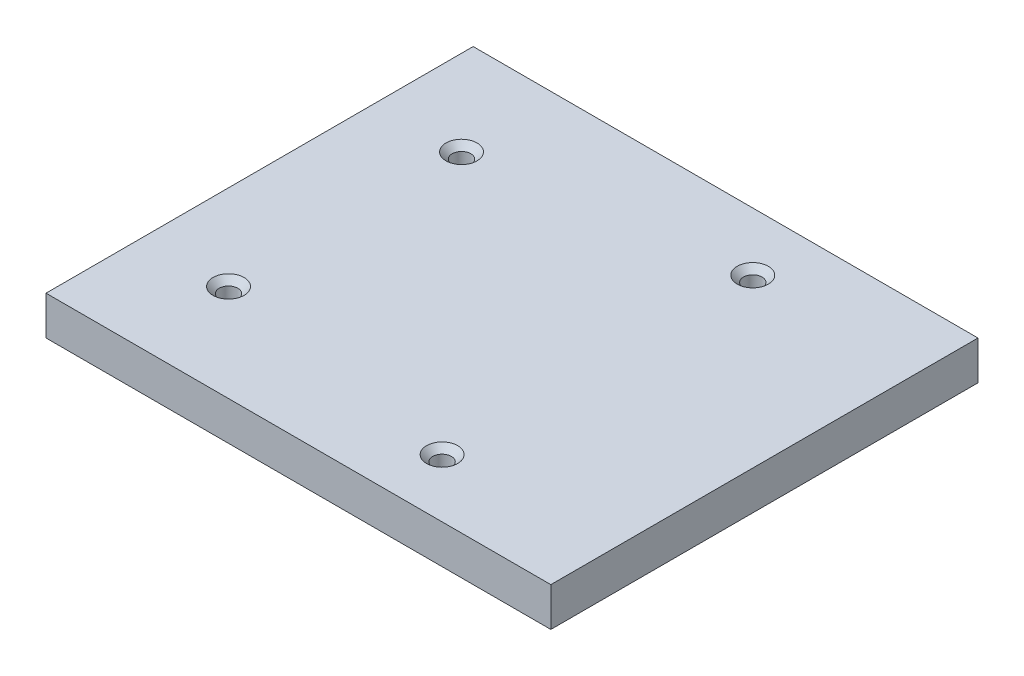
ISO-10303-21;
HEADER;
FILE_DESCRIPTION(('STEP AP214'),'2;1');
FILE_NAME('part.step','',(''),(''),'','','');
FILE_SCHEMA(('AUTOMOTIVE_DESIGN { 1 0 10303 214 1 1 1 1 }'));
ENDSEC;
DATA;
#1=APPLICATION_CONTEXT('core data for automotive mechanical design processes');
#2=APPLICATION_PROTOCOL_DEFINITION('international standard','automotive_design',2000,#1);
#3=PRODUCT_CONTEXT('',#1,'mechanical');
#4=PRODUCT('Part','Part','',(#3));
#5=PRODUCT_RELATED_PRODUCT_CATEGORY('part','',(#4));
#6=PRODUCT_DEFINITION_FORMATION('','',#4);
#7=PRODUCT_DEFINITION_CONTEXT('part definition',#1,'design');
#8=PRODUCT_DEFINITION('design','',#6,#7);
#9=PRODUCT_DEFINITION_SHAPE('','',#8);
#10=(LENGTH_UNIT() NAMED_UNIT(*) SI_UNIT(.MILLI.,.METRE.));
#11=(NAMED_UNIT(*) PLANE_ANGLE_UNIT() SI_UNIT($,.RADIAN.));
#12=(NAMED_UNIT(*) SI_UNIT($,.STERADIAN.) SOLID_ANGLE_UNIT());
#13=UNCERTAINTY_MEASURE_WITH_UNIT(LENGTH_MEASURE(1.E-05),#10,'distance_accuracy_value','');
#14=(GEOMETRIC_REPRESENTATION_CONTEXT(3) GLOBAL_UNCERTAINTY_ASSIGNED_CONTEXT((#13)) GLOBAL_UNIT_ASSIGNED_CONTEXT((#10,
#11,#12)) REPRESENTATION_CONTEXT('',''));
#15=CARTESIAN_POINT('',(0.,0.,0.));
#16=DIRECTION('',(0.,0.,1.));
#17=DIRECTION('',(1.,0.,0.));
#18=AXIS2_PLACEMENT_3D('',#15,#16,#17);
#19=CARTESIAN_POINT('',(0.,5.,0.));
#20=DIRECTION('',(0.,-1.,0.));
#21=DIRECTION('',(0.,0.,-1.));
#22=AXIS2_PLACEMENT_3D('',#19,#20,#21);
#23=PLANE('',#22);
#24=CARTESIAN_POINT('',(22.,5.,40.));
#25=DIRECTION('',(0.,-1.,0.));
#26=DIRECTION('',(0.,0.,-1.));
#27=AXIS2_PLACEMENT_3D('',#24,#25,#26);
#28=CIRCLE('',#27,3.99999999999999);
#29=CARTESIAN_POINT('',(22.,5.,44.));
#30=VERTEX_POINT('',#29);
#31=EDGE_CURVE('E128',#30,#30,#28,.T.);
#32=ORIENTED_EDGE('',*,*,#31,.T.);
#33=EDGE_LOOP('',(#32));
#34=FACE_BOUND('',#33,.T.);
#35=CARTESIAN_POINT('',(-43.,5.,30.));
#36=DIRECTION('',(0.,-1.,0.));
#37=DIRECTION('',(0.,0.,-1.));
#38=AXIS2_PLACEMENT_3D('',#35,#36,#37);
#39=CIRCLE('',#38,3.99999999999999);
#40=CARTESIAN_POINT('',(-43.,5.,34.));
#41=VERTEX_POINT('',#40);
#42=EDGE_CURVE('E125',#41,#41,#39,.T.);
#43=ORIENTED_EDGE('',*,*,#42,.T.);
#44=EDGE_LOOP('',(#43));
#45=FACE_BOUND('',#44,.T.);
#46=CARTESIAN_POINT('',(22.,5.,-40.));
#47=DIRECTION('',(0.,-1.,0.));
#48=DIRECTION('',(0.,0.,-1.));
#49=AXIS2_PLACEMENT_3D('',#46,#47,#48);
#50=CIRCLE('',#49,3.99999999999999);
#51=CARTESIAN_POINT('',(22.,5.,-36.));
#52=VERTEX_POINT('',#51);
#53=EDGE_CURVE('E122',#52,#52,#50,.T.);
#54=ORIENTED_EDGE('',*,*,#53,.T.);
#55=EDGE_LOOP('',(#54));
#56=FACE_BOUND('',#55,.T.);
#57=CARTESIAN_POINT('',(-43.,5.,-30.));
#58=DIRECTION('',(0.,-1.,0.));
#59=DIRECTION('',(0.,0.,-1.));
#60=AXIS2_PLACEMENT_3D('',#57,#58,#59);
#61=CIRCLE('',#60,3.99999999999999);
#62=CARTESIAN_POINT('',(-43.,5.,-26.));
#63=VERTEX_POINT('',#62);
#64=EDGE_CURVE('E119',#63,#63,#61,.T.);
#65=ORIENTED_EDGE('',*,*,#64,.T.);
#66=EDGE_LOOP('',(#65));
#67=FACE_BOUND('',#66,.T.);
#68=DIRECTION('',(0.,0.,-1.));
#69=VECTOR('',#68,1.);
#70=CARTESIAN_POINT('',(65.,5.,55.));
#71=LINE('',#70,#69);
#72=CARTESIAN_POINT('',(65.,5.,55.));
#73=VERTEX_POINT('',#72);
#74=CARTESIAN_POINT('',(65.,5.,-55.));
#75=VERTEX_POINT('',#74);
#76=EDGE_CURVE('E91',#73,#75,#71,.T.);
#77=ORIENTED_EDGE('',*,*,#76,.T.);
#78=DIRECTION('',(-1.,0.,0.));
#79=VECTOR('',#78,1.);
#80=CARTESIAN_POINT('',(-65.,5.,-55.));
#81=LINE('',#80,#79);
#82=CARTESIAN_POINT('',(-65.,5.,-55.));
#83=VERTEX_POINT('',#82);
#84=EDGE_CURVE('E87',#75,#83,#81,.T.);
#85=ORIENTED_EDGE('',*,*,#84,.T.);
#86=DIRECTION('',(0.,0.,1.));
#87=VECTOR('',#86,1.);
#88=CARTESIAN_POINT('',(-65.,5.,55.));
#89=LINE('',#88,#87);
#90=CARTESIAN_POINT('',(-65.,5.,55.));
#91=VERTEX_POINT('',#90);
#92=EDGE_CURVE('E89',#83,#91,#89,.T.);
#93=ORIENTED_EDGE('',*,*,#92,.T.);
#94=DIRECTION('',(1.,0.,0.));
#95=VECTOR('',#94,1.);
#96=CARTESIAN_POINT('',(-65.,5.,55.));
#97=LINE('',#96,#95);
#98=EDGE_CURVE('E56',#91,#73,#97,.T.);
#99=ORIENTED_EDGE('',*,*,#98,.T.);
#100=EDGE_LOOP('',(#77,#85,#93,#99));
#101=FACE_BOUND('',#100,.T.);
#102=ADVANCED_FACE('F38',(#34,#45,#56,#67,#101),#23,.F.);
#103=CARTESIAN_POINT('',(0.,-5.,0.));
#104=DIRECTION('',(0.,-1.,0.));
#105=DIRECTION('',(0.,0.,-1.));
#106=AXIS2_PLACEMENT_3D('',#103,#104,#105);
#107=PLANE('',#106);
#108=CARTESIAN_POINT('',(22.,-5.,-40.));
#109=DIRECTION('',(0.,1.,0.));
#110=DIRECTION('',(0.,0.,1.));
#111=AXIS2_PLACEMENT_3D('',#108,#109,#110);
#112=CIRCLE('',#111,2.4);
#113=CARTESIAN_POINT('',(22.,-5.,-37.6));
#114=VERTEX_POINT('',#113);
#115=EDGE_CURVE('E204',#114,#114,#112,.T.);
#116=ORIENTED_EDGE('',*,*,#115,.T.);
#117=EDGE_LOOP('',(#116));
#118=FACE_BOUND('',#117,.T.);
#119=CARTESIAN_POINT('',(-43.,-5.,-30.));
#120=DIRECTION('',(0.,1.,0.));
#121=DIRECTION('',(0.,0.,1.));
#122=AXIS2_PLACEMENT_3D('',#119,#120,#121);
#123=CIRCLE('',#122,2.4);
#124=CARTESIAN_POINT('',(-43.,-5.,-27.6));
#125=VERTEX_POINT('',#124);
#126=EDGE_CURVE('E109',#125,#125,#123,.T.);
#127=ORIENTED_EDGE('',*,*,#126,.T.);
#128=EDGE_LOOP('',(#127));
#129=FACE_BOUND('',#128,.T.);
#130=DIRECTION('',(0.,0.,-1.));
#131=VECTOR('',#130,1.);
#132=CARTESIAN_POINT('',(65.,-5.,55.));
#133=LINE('',#132,#131);
#134=CARTESIAN_POINT('',(65.,-5.,55.));
#135=VERTEX_POINT('',#134);
#136=CARTESIAN_POINT('',(65.,-5.,-55.));
#137=VERTEX_POINT('',#136);
#138=EDGE_CURVE('E106',#135,#137,#133,.T.);
#139=ORIENTED_EDGE('',*,*,#138,.F.);
#140=DIRECTION('',(1.,0.,0.));
#141=VECTOR('',#140,1.);
#142=CARTESIAN_POINT('',(-65.,-5.,55.));
#143=LINE('',#142,#141);
#144=CARTESIAN_POINT('',(-65.,-5.,55.));
#145=VERTEX_POINT('',#144);
#146=EDGE_CURVE('E79',#145,#135,#143,.T.);
#147=ORIENTED_EDGE('',*,*,#146,.F.);
#148=DIRECTION('',(0.,0.,1.));
#149=VECTOR('',#148,1.);
#150=CARTESIAN_POINT('',(-65.,-5.,55.));
#151=LINE('',#150,#149);
#152=CARTESIAN_POINT('',(-65.,-5.,-55.));
#153=VERTEX_POINT('',#152);
#154=EDGE_CURVE('E73',#153,#145,#151,.T.);
#155=ORIENTED_EDGE('',*,*,#154,.F.);
#156=DIRECTION('',(-1.,0.,0.));
#157=VECTOR('',#156,1.);
#158=CARTESIAN_POINT('',(-65.,-5.,-55.));
#159=LINE('',#158,#157);
#160=EDGE_CURVE('E96',#137,#153,#159,.T.);
#161=ORIENTED_EDGE('',*,*,#160,.F.);
#162=EDGE_LOOP('',(#139,#147,#155,#161));
#163=FACE_BOUND('',#162,.T.);
#164=CARTESIAN_POINT('',(-43.,-5.,30.));
#165=DIRECTION('',(0.,1.,0.));
#166=DIRECTION('',(0.,0.,1.));
#167=AXIS2_PLACEMENT_3D('',#164,#165,#166);
#168=CIRCLE('',#167,2.4);
#169=CARTESIAN_POINT('',(-43.,-5.,32.4));
#170=VERTEX_POINT('',#169);
#171=EDGE_CURVE('E207',#170,#170,#168,.T.);
#172=ORIENTED_EDGE('',*,*,#171,.T.);
#173=EDGE_LOOP('',(#172));
#174=FACE_BOUND('',#173,.T.);
#175=CARTESIAN_POINT('',(22.,-5.,40.));
#176=DIRECTION('',(0.,1.,0.));
#177=DIRECTION('',(0.,0.,1.));
#178=AXIS2_PLACEMENT_3D('',#175,#176,#177);
#179=CIRCLE('',#178,2.4);
#180=CARTESIAN_POINT('',(22.,-5.,42.4));
#181=VERTEX_POINT('',#180);
#182=EDGE_CURVE('E202',#181,#181,#179,.T.);
#183=ORIENTED_EDGE('',*,*,#182,.T.);
#184=EDGE_LOOP('',(#183));
#185=FACE_BOUND('',#184,.T.);
#186=ADVANCED_FACE('F154',(#118,#129,#163,#174,#185),#107,.T.);
#187=CARTESIAN_POINT('',(65.,5.,55.));
#188=DIRECTION('',(-1.,0.,0.));
#189=DIRECTION('',(0.,0.,1.));
#190=AXIS2_PLACEMENT_3D('',#187,#188,#189);
#191=PLANE('',#190);
#192=ORIENTED_EDGE('',*,*,#138,.T.);
#193=DIRECTION('',(0.,-1.,0.));
#194=VECTOR('',#193,1.);
#195=CARTESIAN_POINT('',(65.,5.,-55.));
#196=LINE('',#195,#194);
#197=EDGE_CURVE('E97',#75,#137,#196,.T.);
#198=ORIENTED_EDGE('',*,*,#197,.F.);
#199=ORIENTED_EDGE('',*,*,#76,.F.);
#200=DIRECTION('',(0.,-1.,0.));
#201=VECTOR('',#200,1.);
#202=CARTESIAN_POINT('',(65.,5.,55.));
#203=LINE('',#202,#201);
#204=EDGE_CURVE('E102',#73,#135,#203,.T.);
#205=ORIENTED_EDGE('',*,*,#204,.T.);
#206=EDGE_LOOP('',(#192,#198,#199,#205));
#207=FACE_BOUND('',#206,.T.);
#208=ADVANCED_FACE('F160',(#207),#191,.F.);
#209=CARTESIAN_POINT('',(-65.,5.,-55.));
#210=DIRECTION('',(0.,0.,1.));
#211=DIRECTION('',(1.,0.,0.));
#212=AXIS2_PLACEMENT_3D('',#209,#210,#211);
#213=PLANE('',#212);
#214=ORIENTED_EDGE('',*,*,#160,.T.);
#215=DIRECTION('',(0.,-1.,0.));
#216=VECTOR('',#215,1.);
#217=CARTESIAN_POINT('',(-65.,5.,-55.));
#218=LINE('',#217,#216);
#219=EDGE_CURVE('E94',#83,#153,#218,.T.);
#220=ORIENTED_EDGE('',*,*,#219,.F.);
#221=ORIENTED_EDGE('',*,*,#84,.F.);
#222=ORIENTED_EDGE('',*,*,#197,.T.);
#223=EDGE_LOOP('',(#214,#220,#221,#222));
#224=FACE_BOUND('',#223,.T.);
#225=ADVANCED_FACE('F95',(#224),#213,.F.);
#226=CARTESIAN_POINT('',(-65.,5.,55.));
#227=DIRECTION('',(1.,0.,0.));
#228=DIRECTION('',(0.,0.,-1.));
#229=AXIS2_PLACEMENT_3D('',#226,#227,#228);
#230=PLANE('',#229);
#231=ORIENTED_EDGE('',*,*,#154,.T.);
#232=DIRECTION('',(0.,-1.,0.));
#233=VECTOR('',#232,1.);
#234=CARTESIAN_POINT('',(-65.,5.,55.));
#235=LINE('',#234,#233);
#236=EDGE_CURVE('E98',#91,#145,#235,.T.);
#237=ORIENTED_EDGE('',*,*,#236,.F.);
#238=ORIENTED_EDGE('',*,*,#92,.F.);
#239=ORIENTED_EDGE('',*,*,#219,.T.);
#240=EDGE_LOOP('',(#231,#237,#238,#239));
#241=FACE_BOUND('',#240,.T.);
#242=ADVANCED_FACE('F100',(#241),#230,.F.);
#243=CARTESIAN_POINT('',(-65.,5.,55.));
#244=DIRECTION('',(0.,0.,-1.));
#245=DIRECTION('',(-1.,0.,0.));
#246=AXIS2_PLACEMENT_3D('',#243,#244,#245);
#247=PLANE('',#246);
#248=ORIENTED_EDGE('',*,*,#146,.T.);
#249=ORIENTED_EDGE('',*,*,#204,.F.);
#250=ORIENTED_EDGE('',*,*,#98,.F.);
#251=ORIENTED_EDGE('',*,*,#236,.T.);
#252=EDGE_LOOP('',(#248,#249,#250,#251));
#253=FACE_BOUND('',#252,.T.);
#254=ADVANCED_FACE('F168',(#253),#247,.F.);
#255=CARTESIAN_POINT('',(-43.,5.,-30.));
#256=DIRECTION('',(0.,-1.,0.));
#257=DIRECTION('',(0.,0.,-1.));
#258=AXIS2_PLACEMENT_3D('',#255,#256,#257);
#259=CYLINDRICAL_SURFACE('',#258,2.4);
#260=CARTESIAN_POINT('',(-43.,3.4,-30.));
#261=DIRECTION('',(0.,-1.,0.));
#262=DIRECTION('',(0.,0.,-1.));
#263=AXIS2_PLACEMENT_3D('',#260,#261,#262);
#264=CIRCLE('',#263,2.4);
#265=CARTESIAN_POINT('',(-43.,3.4,-27.6));
#266=VERTEX_POINT('',#265);
#267=EDGE_CURVE('E11',#266,#266,#264,.F.);
#268=ORIENTED_EDGE('',*,*,#267,.T.);
#269=EDGE_LOOP('',(#268));
#270=FACE_BOUND('',#269,.T.);
#271=ORIENTED_EDGE('',*,*,#126,.F.);
#272=EDGE_LOOP('',(#271));
#273=FACE_BOUND('',#272,.T.);
#274=ADVANCED_FACE('F165',(#270,#273),#259,.F.);
#275=CARTESIAN_POINT('',(-43.,5.,30.));
#276=DIRECTION('',(0.,-1.,0.));
#277=DIRECTION('',(0.,0.,-1.));
#278=AXIS2_PLACEMENT_3D('',#275,#276,#277);
#279=CYLINDRICAL_SURFACE('',#278,2.4);
#280=CARTESIAN_POINT('',(-43.,3.4,30.));
#281=DIRECTION('',(0.,-1.,0.));
#282=DIRECTION('',(0.,0.,-1.));
#283=AXIS2_PLACEMENT_3D('',#280,#281,#282);
#284=CIRCLE('',#283,2.4);
#285=CARTESIAN_POINT('',(-43.,3.4,32.4));
#286=VERTEX_POINT('',#285);
#287=EDGE_CURVE('E131',#286,#286,#284,.F.);
#288=ORIENTED_EDGE('',*,*,#287,.T.);
#289=EDGE_LOOP('',(#288));
#290=FACE_BOUND('',#289,.T.);
#291=ORIENTED_EDGE('',*,*,#171,.F.);
#292=EDGE_LOOP('',(#291));
#293=FACE_BOUND('',#292,.T.);
#294=ADVANCED_FACE('F218',(#290,#293),#279,.F.);
#295=CARTESIAN_POINT('',(22.,5.,-40.));
#296=DIRECTION('',(0.,-1.,0.));
#297=DIRECTION('',(0.,0.,-1.));
#298=AXIS2_PLACEMENT_3D('',#295,#296,#297);
#299=CYLINDRICAL_SURFACE('',#298,2.4);
#300=CARTESIAN_POINT('',(22.,3.4,-40.));
#301=DIRECTION('',(0.,-1.,0.));
#302=DIRECTION('',(0.,0.,-1.));
#303=AXIS2_PLACEMENT_3D('',#300,#301,#302);
#304=CIRCLE('',#303,2.4);
#305=CARTESIAN_POINT('',(22.,3.4,-37.6));
#306=VERTEX_POINT('',#305);
#307=EDGE_CURVE('E48',#306,#306,#304,.F.);
#308=ORIENTED_EDGE('',*,*,#307,.T.);
#309=EDGE_LOOP('',(#308));
#310=FACE_BOUND('',#309,.T.);
#311=ORIENTED_EDGE('',*,*,#115,.F.);
#312=EDGE_LOOP('',(#311));
#313=FACE_BOUND('',#312,.T.);
#314=ADVANCED_FACE('F136',(#310,#313),#299,.F.);
#315=CARTESIAN_POINT('',(22.,5.,40.));
#316=DIRECTION('',(0.,-1.,0.));
#317=DIRECTION('',(0.,0.,-1.));
#318=AXIS2_PLACEMENT_3D('',#315,#316,#317);
#319=CYLINDRICAL_SURFACE('',#318,2.4);
#320=CARTESIAN_POINT('',(22.,3.4,40.));
#321=DIRECTION('',(0.,-1.,0.));
#322=DIRECTION('',(0.,0.,-1.));
#323=AXIS2_PLACEMENT_3D('',#320,#321,#322);
#324=CIRCLE('',#323,2.4);
#325=CARTESIAN_POINT('',(22.,3.4,42.4));
#326=VERTEX_POINT('',#325);
#327=EDGE_CURVE('E116',#326,#326,#324,.F.);
#328=ORIENTED_EDGE('',*,*,#327,.T.);
#329=EDGE_LOOP('',(#328));
#330=FACE_BOUND('',#329,.T.);
#331=ORIENTED_EDGE('',*,*,#182,.F.);
#332=EDGE_LOOP('',(#331));
#333=FACE_BOUND('',#332,.T.);
#334=ADVANCED_FACE('F183',(#330,#333),#319,.F.);
#335=CARTESIAN_POINT('',(22.,3.4,40.));
#336=DIRECTION('',(0.,1.,0.));
#337=DIRECTION('',(0.,0.,1.));
#338=AXIS2_PLACEMENT_3D('',#335,#336,#337);
#339=CONICAL_SURFACE('',#338,2.4,0.785398163397446);
#340=CARTESIAN_POINT('',(22.,5.,44.));
#341=CARTESIAN_POINT('',(22.,4.98333333333334,43.9833333333333));
#342=CARTESIAN_POINT('',(22.,4.96666666666667,43.9666666666667));
#343=CARTESIAN_POINT('',(22.,4.93333333333333,43.9333333333333));
#344=CARTESIAN_POINT('',(22.,4.91666666666667,43.9166666666667));
#345=CARTESIAN_POINT('',(22.,4.88333333333333,43.8833333333333));
#346=CARTESIAN_POINT('',(22.,4.86666666666667,43.8666666666667));
#347=CARTESIAN_POINT('',(22.,4.83333333333333,43.8333333333333));
#348=CARTESIAN_POINT('',(22.,4.81666666666667,43.8166666666667));
#349=CARTESIAN_POINT('',(22.,4.78333333333333,43.7833333333333));
#350=CARTESIAN_POINT('',(22.,4.76666666666667,43.7666666666667));
#351=CARTESIAN_POINT('',(22.,4.73333333333333,43.7333333333333));
#352=CARTESIAN_POINT('',(22.,4.71666666666667,43.7166666666667));
#353=CARTESIAN_POINT('',(22.,4.68333333333333,43.6833333333333));
#354=CARTESIAN_POINT('',(22.,4.66666666666667,43.6666666666667));
#355=CARTESIAN_POINT('',(22.,4.63333333333333,43.6333333333333));
#356=CARTESIAN_POINT('',(22.,4.61666666666667,43.6166666666667));
#357=CARTESIAN_POINT('',(22.,4.58333333333333,43.5833333333333));
#358=CARTESIAN_POINT('',(22.,4.56666666666667,43.5666666666667));
#359=CARTESIAN_POINT('',(22.,4.53333333333333,43.5333333333333));
#360=CARTESIAN_POINT('',(22.,4.51666666666667,43.5166666666667));
#361=CARTESIAN_POINT('',(22.,4.48333333333333,43.4833333333333));
#362=CARTESIAN_POINT('',(22.,4.46666666666667,43.4666666666667));
#363=CARTESIAN_POINT('',(22.,4.43333333333334,43.4333333333333));
#364=CARTESIAN_POINT('',(22.,4.41666666666667,43.4166666666667));
#365=CARTESIAN_POINT('',(22.,4.38333333333333,43.3833333333333));
#366=CARTESIAN_POINT('',(22.,4.36666666666667,43.3666666666667));
#367=CARTESIAN_POINT('',(22.,4.33333333333334,43.3333333333333));
#368=CARTESIAN_POINT('',(22.,4.31666666666667,43.3166666666667));
#369=CARTESIAN_POINT('',(22.,4.28333333333333,43.2833333333333));
#370=CARTESIAN_POINT('',(22.,4.26666666666667,43.2666666666667));
#371=CARTESIAN_POINT('',(22.,4.23333333333334,43.2333333333333));
#372=CARTESIAN_POINT('',(22.,4.21666666666667,43.2166666666667));
#373=CARTESIAN_POINT('',(22.,4.18333333333334,43.1833333333333));
#374=CARTESIAN_POINT('',(22.,4.16666666666667,43.1666666666667));
#375=CARTESIAN_POINT('',(22.,4.13333333333334,43.1333333333333));
#376=CARTESIAN_POINT('',(22.,4.11666666666667,43.1166666666667));
#377=CARTESIAN_POINT('',(22.,4.08333333333333,43.0833333333333));
#378=CARTESIAN_POINT('',(22.,4.06666666666667,43.0666666666667));
#379=CARTESIAN_POINT('',(22.,4.03333333333334,43.0333333333333));
#380=CARTESIAN_POINT('',(22.,4.01666666666667,43.0166666666667));
#381=CARTESIAN_POINT('',(22.,3.98333333333334,42.9833333333333));
#382=CARTESIAN_POINT('',(22.,3.96666666666667,42.9666666666667));
#383=CARTESIAN_POINT('',(22.,3.93333333333334,42.9333333333333));
#384=CARTESIAN_POINT('',(22.,3.91666666666667,42.9166666666667));
#385=CARTESIAN_POINT('',(22.,3.88333333333334,42.8833333333333));
#386=CARTESIAN_POINT('',(22.,3.86666666666667,42.8666666666667));
#387=CARTESIAN_POINT('',(22.,3.83333333333334,42.8333333333333));
#388=CARTESIAN_POINT('',(22.,3.81666666666667,42.8166666666667));
#389=CARTESIAN_POINT('',(22.,3.78333333333334,42.7833333333333));
#390=CARTESIAN_POINT('',(22.,3.76666666666667,42.7666666666667));
#391=CARTESIAN_POINT('',(22.,3.73333333333334,42.7333333333333));
#392=CARTESIAN_POINT('',(22.,3.71666666666667,42.7166666666667));
#393=CARTESIAN_POINT('',(22.,3.68333333333334,42.6833333333333));
#394=CARTESIAN_POINT('',(22.,3.66666666666667,42.6666666666667));
#395=CARTESIAN_POINT('',(22.,3.63333333333334,42.6333333333333));
#396=CARTESIAN_POINT('',(22.,3.61666666666667,42.6166666666667));
#397=CARTESIAN_POINT('',(22.,3.58333333333334,42.5833333333333));
#398=CARTESIAN_POINT('',(22.,3.56666666666667,42.5666666666667));
#399=CARTESIAN_POINT('',(22.,3.53333333333334,42.5333333333333));
#400=CARTESIAN_POINT('',(22.,3.51666666666667,42.5166666666667));
#401=CARTESIAN_POINT('',(22.,3.48333333333334,42.4833333333333));
#402=CARTESIAN_POINT('',(22.,3.46666666666667,42.4666666666667));
#403=CARTESIAN_POINT('',(22.,3.43333333333334,42.4333333333333));
#404=CARTESIAN_POINT('',(22.,3.41666666666667,42.4166666666667));
#405=CARTESIAN_POINT('',(22.,3.4,42.4));
#406=B_SPLINE_CURVE_WITH_KNOTS('',3,(#340,#341,#342,#343,#344,#345,#346,#347,#348,#349,#350,
#351,#352,#353,#354,#355,#356,#357,#358,#359,#360,#361,#362,#363,#364,#365,#366,#367,#368,#369,
#370,#371,#372,#373,#374,#375,#376,#377,#378,#379,#380,#381,#382,#383,#384,#385,#386,#387,#388,
#389,#390,#391,#392,#393,#394,#395,#396,#397,#398,#399,#400,#401,#402,#403,#404,#405),
.UNSPECIFIED.,.F.,.F.,(4,2,2,2,2,2,2,2,2,2,2,2,2,2,2,2,2,2,2,2,2,2,2,2,2,2,2,2,2,2,2,2,4),(0.,
0.0707106781186556,0.141421356237306,0.212132034355962,0.282842712474618,0.353553390593274,
0.424264068711924,0.49497474683058,0.565685424949235,0.636396103067891,0.707106781186542,
0.777817459305198,0.848528137423854,0.919238815542509,0.98994949366116,1.06066017177982,
1.13137084989847,1.20208152801713,1.27279220613578,1.34350288425443,1.41421356237309,
1.48492424049174,1.5556349186104,1.62634559672905,1.69705627484771,1.76776695296636,
1.83847763108501,1.90918830920367,1.97989898732232,2.05060966544098,2.12132034355963,
2.19203102167829,2.26274169979694),.UNSPECIFIED.);
#407=EDGE_CURVE('BSEAM148',#30,#326,#406,.T.);
#408=ORIENTED_EDGE('',*,*,#31,.F.);
#409=ORIENTED_EDGE('',*,*,#327,.F.);
#410=ORIENTED_EDGE('',*,*,#407,.T.);
#411=ORIENTED_EDGE('',*,*,#407,.F.);
#412=EDGE_LOOP('',(#408,#410,#409,#411));
#413=FACE_BOUND('',#412,.T.);
#414=ADVANCED_FACE('F148',(#413),#339,.F.);
#415=CARTESIAN_POINT('',(-43.,3.4,30.));
#416=DIRECTION('',(0.,1.,0.));
#417=DIRECTION('',(0.,0.,1.));
#418=AXIS2_PLACEMENT_3D('',#415,#416,#417);
#419=CONICAL_SURFACE('',#418,2.4,0.785398163397446);
#420=CARTESIAN_POINT('',(-43.,5.,34.));
#421=CARTESIAN_POINT('',(-43.,4.98333333333334,33.9833333333333));
#422=CARTESIAN_POINT('',(-43.,4.96666666666667,33.9666666666667));
#423=CARTESIAN_POINT('',(-43.,4.93333333333333,33.9333333333333));
#424=CARTESIAN_POINT('',(-43.,4.91666666666667,33.9166666666667));
#425=CARTESIAN_POINT('',(-43.,4.88333333333333,33.8833333333333));
#426=CARTESIAN_POINT('',(-43.,4.86666666666667,33.8666666666667));
#427=CARTESIAN_POINT('',(-43.,4.83333333333333,33.8333333333333));
#428=CARTESIAN_POINT('',(-43.,4.81666666666667,33.8166666666667));
#429=CARTESIAN_POINT('',(-43.,4.78333333333333,33.7833333333333));
#430=CARTESIAN_POINT('',(-43.,4.76666666666667,33.7666666666667));
#431=CARTESIAN_POINT('',(-43.,4.73333333333333,33.7333333333333));
#432=CARTESIAN_POINT('',(-43.,4.71666666666667,33.7166666666667));
#433=CARTESIAN_POINT('',(-43.,4.68333333333333,33.6833333333333));
#434=CARTESIAN_POINT('',(-43.,4.66666666666667,33.6666666666667));
#435=CARTESIAN_POINT('',(-43.,4.63333333333333,33.6333333333333));
#436=CARTESIAN_POINT('',(-43.,4.61666666666667,33.6166666666667));
#437=CARTESIAN_POINT('',(-43.,4.58333333333333,33.5833333333333));
#438=CARTESIAN_POINT('',(-43.,4.56666666666667,33.5666666666667));
#439=CARTESIAN_POINT('',(-43.,4.53333333333333,33.5333333333333));
#440=CARTESIAN_POINT('',(-43.,4.51666666666667,33.5166666666667));
#441=CARTESIAN_POINT('',(-43.,4.48333333333333,33.4833333333333));
#442=CARTESIAN_POINT('',(-43.,4.46666666666667,33.4666666666667));
#443=CARTESIAN_POINT('',(-43.,4.43333333333334,33.4333333333333));
#444=CARTESIAN_POINT('',(-43.,4.41666666666667,33.4166666666667));
#445=CARTESIAN_POINT('',(-43.,4.38333333333333,33.3833333333333));
#446=CARTESIAN_POINT('',(-43.,4.36666666666667,33.3666666666667));
#447=CARTESIAN_POINT('',(-43.,4.33333333333334,33.3333333333333));
#448=CARTESIAN_POINT('',(-43.,4.31666666666667,33.3166666666667));
#449=CARTESIAN_POINT('',(-43.,4.28333333333333,33.2833333333333));
#450=CARTESIAN_POINT('',(-43.,4.26666666666667,33.2666666666667));
#451=CARTESIAN_POINT('',(-43.,4.23333333333334,33.2333333333333));
#452=CARTESIAN_POINT('',(-43.,4.21666666666667,33.2166666666667));
#453=CARTESIAN_POINT('',(-43.,4.18333333333334,33.1833333333333));
#454=CARTESIAN_POINT('',(-43.,4.16666666666667,33.1666666666667));
#455=CARTESIAN_POINT('',(-43.,4.13333333333334,33.1333333333333));
#456=CARTESIAN_POINT('',(-43.,4.11666666666667,33.1166666666667));
#457=CARTESIAN_POINT('',(-43.,4.08333333333333,33.0833333333333));
#458=CARTESIAN_POINT('',(-43.,4.06666666666667,33.0666666666667));
#459=CARTESIAN_POINT('',(-43.,4.03333333333334,33.0333333333333));
#460=CARTESIAN_POINT('',(-43.,4.01666666666667,33.0166666666667));
#461=CARTESIAN_POINT('',(-43.,3.98333333333334,32.9833333333333));
#462=CARTESIAN_POINT('',(-43.,3.96666666666667,32.9666666666667));
#463=CARTESIAN_POINT('',(-43.,3.93333333333334,32.9333333333333));
#464=CARTESIAN_POINT('',(-43.,3.91666666666667,32.9166666666667));
#465=CARTESIAN_POINT('',(-43.,3.88333333333334,32.8833333333333));
#466=CARTESIAN_POINT('',(-43.,3.86666666666667,32.8666666666667));
#467=CARTESIAN_POINT('',(-43.,3.83333333333334,32.8333333333333));
#468=CARTESIAN_POINT('',(-43.,3.81666666666667,32.8166666666667));
#469=CARTESIAN_POINT('',(-43.,3.78333333333334,32.7833333333333));
#470=CARTESIAN_POINT('',(-43.,3.76666666666667,32.7666666666667));
#471=CARTESIAN_POINT('',(-43.,3.73333333333334,32.7333333333333));
#472=CARTESIAN_POINT('',(-43.,3.71666666666667,32.7166666666667));
#473=CARTESIAN_POINT('',(-43.,3.68333333333334,32.6833333333333));
#474=CARTESIAN_POINT('',(-43.,3.66666666666667,32.6666666666667));
#475=CARTESIAN_POINT('',(-43.,3.63333333333334,32.6333333333333));
#476=CARTESIAN_POINT('',(-43.,3.61666666666667,32.6166666666667));
#477=CARTESIAN_POINT('',(-43.,3.58333333333334,32.5833333333333));
#478=CARTESIAN_POINT('',(-43.,3.56666666666667,32.5666666666667));
#479=CARTESIAN_POINT('',(-43.,3.53333333333334,32.5333333333333));
#480=CARTESIAN_POINT('',(-43.,3.51666666666667,32.5166666666667));
#481=CARTESIAN_POINT('',(-43.,3.48333333333334,32.4833333333333));
#482=CARTESIAN_POINT('',(-43.,3.46666666666667,32.4666666666667));
#483=CARTESIAN_POINT('',(-43.,3.43333333333334,32.4333333333333));
#484=CARTESIAN_POINT('',(-43.,3.41666666666667,32.4166666666667));
#485=CARTESIAN_POINT('',(-43.,3.4,32.4));
#486=B_SPLINE_CURVE_WITH_KNOTS('',3,(#420,#421,#422,#423,#424,#425,#426,#427,#428,#429,#430,
#431,#432,#433,#434,#435,#436,#437,#438,#439,#440,#441,#442,#443,#444,#445,#446,#447,#448,#449,
#450,#451,#452,#453,#454,#455,#456,#457,#458,#459,#460,#461,#462,#463,#464,#465,#466,#467,#468,
#469,#470,#471,#472,#473,#474,#475,#476,#477,#478,#479,#480,#481,#482,#483,#484,#485),
.UNSPECIFIED.,.F.,.F.,(4,2,2,2,2,2,2,2,2,2,2,2,2,2,2,2,2,2,2,2,2,2,2,2,2,2,2,2,2,2,2,2,4),(0.,
0.0707106781186556,0.141421356237306,0.212132034355962,0.282842712474618,0.353553390593274,
0.424264068711924,0.49497474683058,0.565685424949235,0.636396103067891,0.707106781186542,
0.777817459305198,0.848528137423854,0.919238815542509,0.98994949366116,1.06066017177982,
1.13137084989847,1.20208152801713,1.27279220613578,1.34350288425443,1.41421356237309,
1.48492424049174,1.5556349186104,1.62634559672905,1.69705627484771,1.76776695296636,
1.83847763108501,1.90918830920367,1.97989898732232,2.05060966544098,2.12132034355963,
2.19203102167829,2.26274169979694),.UNSPECIFIED.);
#487=EDGE_CURVE('BSEAM141',#41,#286,#486,.T.);
#488=ORIENTED_EDGE('',*,*,#42,.F.);
#489=ORIENTED_EDGE('',*,*,#287,.F.);
#490=ORIENTED_EDGE('',*,*,#487,.T.);
#491=ORIENTED_EDGE('',*,*,#487,.F.);
#492=EDGE_LOOP('',(#488,#490,#489,#491));
#493=FACE_BOUND('',#492,.T.);
#494=ADVANCED_FACE('F141',(#493),#419,.F.);
#495=CARTESIAN_POINT('',(22.,3.4,-40.));
#496=DIRECTION('',(0.,1.,0.));
#497=DIRECTION('',(0.,0.,1.));
#498=AXIS2_PLACEMENT_3D('',#495,#496,#497);
#499=CONICAL_SURFACE('',#498,2.4,0.785398163397446);
#500=CARTESIAN_POINT('',(22.,5.,-36.));
#501=CARTESIAN_POINT('',(22.,4.98333333333334,-36.0166666666667));
#502=CARTESIAN_POINT('',(22.,4.96666666666667,-36.0333333333333));
#503=CARTESIAN_POINT('',(22.,4.93333333333333,-36.0666666666667));
#504=CARTESIAN_POINT('',(22.,4.91666666666667,-36.0833333333333));
#505=CARTESIAN_POINT('',(22.,4.88333333333333,-36.1166666666667));
#506=CARTESIAN_POINT('',(22.,4.86666666666667,-36.1333333333333));
#507=CARTESIAN_POINT('',(22.,4.83333333333333,-36.1666666666667));
#508=CARTESIAN_POINT('',(22.,4.81666666666667,-36.1833333333333));
#509=CARTESIAN_POINT('',(22.,4.78333333333333,-36.2166666666667));
#510=CARTESIAN_POINT('',(22.,4.76666666666667,-36.2333333333333));
#511=CARTESIAN_POINT('',(22.,4.73333333333333,-36.2666666666667));
#512=CARTESIAN_POINT('',(22.,4.71666666666667,-36.2833333333333));
#513=CARTESIAN_POINT('',(22.,4.68333333333333,-36.3166666666667));
#514=CARTESIAN_POINT('',(22.,4.66666666666667,-36.3333333333333));
#515=CARTESIAN_POINT('',(22.,4.63333333333333,-36.3666666666667));
#516=CARTESIAN_POINT('',(22.,4.61666666666667,-36.3833333333333));
#517=CARTESIAN_POINT('',(22.,4.58333333333333,-36.4166666666667));
#518=CARTESIAN_POINT('',(22.,4.56666666666667,-36.4333333333333));
#519=CARTESIAN_POINT('',(22.,4.53333333333333,-36.4666666666667));
#520=CARTESIAN_POINT('',(22.,4.51666666666667,-36.4833333333333));
#521=CARTESIAN_POINT('',(22.,4.48333333333333,-36.5166666666667));
#522=CARTESIAN_POINT('',(22.,4.46666666666667,-36.5333333333333));
#523=CARTESIAN_POINT('',(22.,4.43333333333334,-36.5666666666667));
#524=CARTESIAN_POINT('',(22.,4.41666666666667,-36.5833333333333));
#525=CARTESIAN_POINT('',(22.,4.38333333333333,-36.6166666666667));
#526=CARTESIAN_POINT('',(22.,4.36666666666667,-36.6333333333333));
#527=CARTESIAN_POINT('',(22.,4.33333333333334,-36.6666666666667));
#528=CARTESIAN_POINT('',(22.,4.31666666666667,-36.6833333333333));
#529=CARTESIAN_POINT('',(22.,4.28333333333333,-36.7166666666667));
#530=CARTESIAN_POINT('',(22.,4.26666666666667,-36.7333333333333));
#531=CARTESIAN_POINT('',(22.,4.23333333333334,-36.7666666666667));
#532=CARTESIAN_POINT('',(22.,4.21666666666667,-36.7833333333333));
#533=CARTESIAN_POINT('',(22.,4.18333333333334,-36.8166666666667));
#534=CARTESIAN_POINT('',(22.,4.16666666666667,-36.8333333333333));
#535=CARTESIAN_POINT('',(22.,4.13333333333334,-36.8666666666667));
#536=CARTESIAN_POINT('',(22.,4.11666666666667,-36.8833333333333));
#537=CARTESIAN_POINT('',(22.,4.08333333333333,-36.9166666666667));
#538=CARTESIAN_POINT('',(22.,4.06666666666667,-36.9333333333333));
#539=CARTESIAN_POINT('',(22.,4.03333333333334,-36.9666666666667));
#540=CARTESIAN_POINT('',(22.,4.01666666666667,-36.9833333333333));
#541=CARTESIAN_POINT('',(22.,3.98333333333334,-37.0166666666667));
#542=CARTESIAN_POINT('',(22.,3.96666666666667,-37.0333333333333));
#543=CARTESIAN_POINT('',(22.,3.93333333333334,-37.0666666666667));
#544=CARTESIAN_POINT('',(22.,3.91666666666667,-37.0833333333333));
#545=CARTESIAN_POINT('',(22.,3.88333333333334,-37.1166666666667));
#546=CARTESIAN_POINT('',(22.,3.86666666666667,-37.1333333333333));
#547=CARTESIAN_POINT('',(22.,3.83333333333334,-37.1666666666667));
#548=CARTESIAN_POINT('',(22.,3.81666666666667,-37.1833333333333));
#549=CARTESIAN_POINT('',(22.,3.78333333333334,-37.2166666666667));
#550=CARTESIAN_POINT('',(22.,3.76666666666667,-37.2333333333333));
#551=CARTESIAN_POINT('',(22.,3.73333333333334,-37.2666666666667));
#552=CARTESIAN_POINT('',(22.,3.71666666666667,-37.2833333333333));
#553=CARTESIAN_POINT('',(22.,3.68333333333334,-37.3166666666667));
#554=CARTESIAN_POINT('',(22.,3.66666666666667,-37.3333333333333));
#555=CARTESIAN_POINT('',(22.,3.63333333333334,-37.3666666666667));
#556=CARTESIAN_POINT('',(22.,3.61666666666667,-37.3833333333333));
#557=CARTESIAN_POINT('',(22.,3.58333333333334,-37.4166666666667));
#558=CARTESIAN_POINT('',(22.,3.56666666666667,-37.4333333333333));
#559=CARTESIAN_POINT('',(22.,3.53333333333334,-37.4666666666667));
#560=CARTESIAN_POINT('',(22.,3.51666666666667,-37.4833333333333));
#561=CARTESIAN_POINT('',(22.,3.48333333333334,-37.5166666666667));
#562=CARTESIAN_POINT('',(22.,3.46666666666667,-37.5333333333333));
#563=CARTESIAN_POINT('',(22.,3.43333333333334,-37.5666666666667));
#564=CARTESIAN_POINT('',(22.,3.41666666666667,-37.5833333333333));
#565=CARTESIAN_POINT('',(22.,3.4,-37.6));
#566=B_SPLINE_CURVE_WITH_KNOTS('',3,(#500,#501,#502,#503,#504,#505,#506,#507,#508,#509,#510,
#511,#512,#513,#514,#515,#516,#517,#518,#519,#520,#521,#522,#523,#524,#525,#526,#527,#528,#529,
#530,#531,#532,#533,#534,#535,#536,#537,#538,#539,#540,#541,#542,#543,#544,#545,#546,#547,#548,
#549,#550,#551,#552,#553,#554,#555,#556,#557,#558,#559,#560,#561,#562,#563,#564,#565),
.UNSPECIFIED.,.F.,.F.,(4,2,2,2,2,2,2,2,2,2,2,2,2,2,2,2,2,2,2,2,2,2,2,2,2,2,2,2,2,2,2,2,4),(0.,
0.0707106781186556,0.141421356237306,0.212132034355962,0.282842712474618,0.353553390593274,
0.424264068711924,0.49497474683058,0.565685424949235,0.636396103067891,0.707106781186542,
0.777817459305198,0.848528137423854,0.919238815542509,0.98994949366116,1.06066017177982,
1.13137084989847,1.20208152801713,1.27279220613578,1.34350288425443,1.41421356237309,
1.48492424049174,1.5556349186104,1.62634559672905,1.69705627484771,1.76776695296636,
1.83847763108501,1.90918830920367,1.97989898732232,2.05060966544098,2.12132034355963,
2.19203102167829,2.26274169979694),.UNSPECIFIED.);
#567=EDGE_CURVE('BSEAM139',#52,#306,#566,.T.);
#568=ORIENTED_EDGE('',*,*,#53,.F.);
#569=ORIENTED_EDGE('',*,*,#307,.F.);
#570=ORIENTED_EDGE('',*,*,#567,.T.);
#571=ORIENTED_EDGE('',*,*,#567,.F.);
#572=EDGE_LOOP('',(#568,#570,#569,#571));
#573=FACE_BOUND('',#572,.T.);
#574=ADVANCED_FACE('F139',(#573),#499,.F.);
#575=CARTESIAN_POINT('',(-43.,3.4,-30.));
#576=DIRECTION('',(0.,1.,0.));
#577=DIRECTION('',(0.,0.,1.));
#578=AXIS2_PLACEMENT_3D('',#575,#576,#577);
#579=CONICAL_SURFACE('',#578,2.4,0.785398163397446);
#580=CARTESIAN_POINT('',(-43.,5.,-26.));
#581=CARTESIAN_POINT('',(-43.,4.98333333333333,-26.0166666666667));
#582=CARTESIAN_POINT('',(-43.,4.96666666666667,-26.0333333333333));
#583=CARTESIAN_POINT('',(-43.,4.93333333333333,-26.0666666666667));
#584=CARTESIAN_POINT('',(-43.,4.91666666666667,-26.0833333333333));
#585=CARTESIAN_POINT('',(-43.,4.88333333333333,-26.1166666666667));
#586=CARTESIAN_POINT('',(-43.,4.86666666666667,-26.1333333333333));
#587=CARTESIAN_POINT('',(-43.,4.83333333333333,-26.1666666666667));
#588=CARTESIAN_POINT('',(-43.,4.81666666666667,-26.1833333333333));
#589=CARTESIAN_POINT('',(-43.,4.78333333333333,-26.2166666666667));
#590=CARTESIAN_POINT('',(-43.,4.76666666666667,-26.2333333333333));
#591=CARTESIAN_POINT('',(-43.,4.73333333333333,-26.2666666666667));
#592=CARTESIAN_POINT('',(-43.,4.71666666666667,-26.2833333333333));
#593=CARTESIAN_POINT('',(-43.,4.68333333333333,-26.3166666666667));
#594=CARTESIAN_POINT('',(-43.,4.66666666666667,-26.3333333333333));
#595=CARTESIAN_POINT('',(-43.,4.63333333333333,-26.3666666666667));
#596=CARTESIAN_POINT('',(-43.,4.61666666666667,-26.3833333333333));
#597=CARTESIAN_POINT('',(-43.,4.58333333333333,-26.4166666666667));
#598=CARTESIAN_POINT('',(-43.,4.56666666666667,-26.4333333333333));
#599=CARTESIAN_POINT('',(-43.,4.53333333333333,-26.4666666666667));
#600=CARTESIAN_POINT('',(-43.,4.51666666666667,-26.4833333333333));
#601=CARTESIAN_POINT('',(-43.,4.48333333333334,-26.5166666666667));
#602=CARTESIAN_POINT('',(-43.,4.46666666666667,-26.5333333333333));
#603=CARTESIAN_POINT('',(-43.,4.43333333333333,-26.5666666666667));
#604=CARTESIAN_POINT('',(-43.,4.41666666666667,-26.5833333333333));
#605=CARTESIAN_POINT('',(-43.,4.38333333333333,-26.6166666666667));
#606=CARTESIAN_POINT('',(-43.,4.36666666666667,-26.6333333333333));
#607=CARTESIAN_POINT('',(-43.,4.33333333333333,-26.6666666666667));
#608=CARTESIAN_POINT('',(-43.,4.31666666666667,-26.6833333333333));
#609=CARTESIAN_POINT('',(-43.,4.28333333333333,-26.7166666666667));
#610=CARTESIAN_POINT('',(-43.,4.26666666666667,-26.7333333333333));
#611=CARTESIAN_POINT('',(-43.,4.23333333333334,-26.7666666666667));
#612=CARTESIAN_POINT('',(-43.,4.21666666666667,-26.7833333333333));
#613=CARTESIAN_POINT('',(-43.,4.18333333333334,-26.8166666666667));
#614=CARTESIAN_POINT('',(-43.,4.16666666666667,-26.8333333333333));
#615=CARTESIAN_POINT('',(-43.,4.13333333333334,-26.8666666666667));
#616=CARTESIAN_POINT('',(-43.,4.11666666666667,-26.8833333333333));
#617=CARTESIAN_POINT('',(-43.,4.08333333333334,-26.9166666666667));
#618=CARTESIAN_POINT('',(-43.,4.06666666666667,-26.9333333333333));
#619=CARTESIAN_POINT('',(-43.,4.03333333333334,-26.9666666666667));
#620=CARTESIAN_POINT('',(-43.,4.01666666666667,-26.9833333333333));
#621=CARTESIAN_POINT('',(-43.,3.98333333333334,-27.0166666666667));
#622=CARTESIAN_POINT('',(-43.,3.96666666666667,-27.0333333333333));
#623=CARTESIAN_POINT('',(-43.,3.93333333333334,-27.0666666666667));
#624=CARTESIAN_POINT('',(-43.,3.91666666666667,-27.0833333333333));
#625=CARTESIAN_POINT('',(-43.,3.88333333333334,-27.1166666666667));
#626=CARTESIAN_POINT('',(-43.,3.86666666666667,-27.1333333333333));
#627=CARTESIAN_POINT('',(-43.,3.83333333333334,-27.1666666666667));
#628=CARTESIAN_POINT('',(-43.,3.81666666666667,-27.1833333333333));
#629=CARTESIAN_POINT('',(-43.,3.78333333333334,-27.2166666666667));
#630=CARTESIAN_POINT('',(-43.,3.76666666666667,-27.2333333333333));
#631=CARTESIAN_POINT('',(-43.,3.73333333333334,-27.2666666666667));
#632=CARTESIAN_POINT('',(-43.,3.71666666666667,-27.2833333333333));
#633=CARTESIAN_POINT('',(-43.,3.68333333333334,-27.3166666666667));
#634=CARTESIAN_POINT('',(-43.,3.66666666666667,-27.3333333333333));
#635=CARTESIAN_POINT('',(-43.,3.63333333333334,-27.3666666666667));
#636=CARTESIAN_POINT('',(-43.,3.61666666666667,-27.3833333333333));
#637=CARTESIAN_POINT('',(-43.,3.58333333333334,-27.4166666666667));
#638=CARTESIAN_POINT('',(-43.,3.56666666666667,-27.4333333333333));
#639=CARTESIAN_POINT('',(-43.,3.53333333333334,-27.4666666666667));
#640=CARTESIAN_POINT('',(-43.,3.51666666666667,-27.4833333333333));
#641=CARTESIAN_POINT('',(-43.,3.48333333333334,-27.5166666666667));
#642=CARTESIAN_POINT('',(-43.,3.46666666666667,-27.5333333333333));
#643=CARTESIAN_POINT('',(-43.,3.43333333333334,-27.5666666666667));
#644=CARTESIAN_POINT('',(-43.,3.41666666666667,-27.5833333333333));
#645=CARTESIAN_POINT('',(-43.,3.4,-27.6));
#646=B_SPLINE_CURVE_WITH_KNOTS('',3,(#580,#581,#582,#583,#584,#585,#586,#587,#588,#589,#590,
#591,#592,#593,#594,#595,#596,#597,#598,#599,#600,#601,#602,#603,#604,#605,#606,#607,#608,#609,
#610,#611,#612,#613,#614,#615,#616,#617,#618,#619,#620,#621,#622,#623,#624,#625,#626,#627,#628,
#629,#630,#631,#632,#633,#634,#635,#636,#637,#638,#639,#640,#641,#642,#643,#644,#645),
.UNSPECIFIED.,.F.,.F.,(4,2,2,2,2,2,2,2,2,2,2,2,2,2,2,2,2,2,2,2,2,2,2,2,2,2,2,2,2,2,2,2,4),(0.,
0.0707106781186556,0.141421356237309,0.212132034355962,0.282842712474618,0.353553390593271,
0.424264068711927,0.49497474683058,0.565685424949235,0.636396103067889,0.707106781186545,
0.777817459305198,0.848528137423854,0.919238815542507,0.989949493661162,1.06066017177982,
1.13137084989847,1.20208152801712,1.27279220613578,1.34350288425443,1.41421356237309,
1.48492424049174,1.5556349186104,1.62634559672905,1.69705627484771,1.76776695296636,
1.83847763108502,1.90918830920367,1.97989898732232,2.05060966544098,2.12132034355963,
2.19203102167829,2.26274169979694),.UNSPECIFIED.);
#647=EDGE_CURVE('BSEAM41',#63,#266,#646,.T.);
#648=ORIENTED_EDGE('',*,*,#64,.F.);
#649=ORIENTED_EDGE('',*,*,#267,.F.);
#650=ORIENTED_EDGE('',*,*,#647,.T.);
#651=ORIENTED_EDGE('',*,*,#647,.F.);
#652=EDGE_LOOP('',(#648,#650,#649,#651));
#653=FACE_BOUND('',#652,.T.);
#654=ADVANCED_FACE('F41',(#653),#579,.F.);
#655=CLOSED_SHELL('',(#102,#186,#208,#225,#242,#254,#274,#294,#314,#334,#414,#494,#574,#654));
#656=MANIFOLD_SOLID_BREP('B2',#655);
#657=ADVANCED_BREP_SHAPE_REPRESENTATION('',(#18,#656),#14);
#658=SHAPE_DEFINITION_REPRESENTATION(#9,#657);
ENDSEC;
END-ISO-10303-21;
